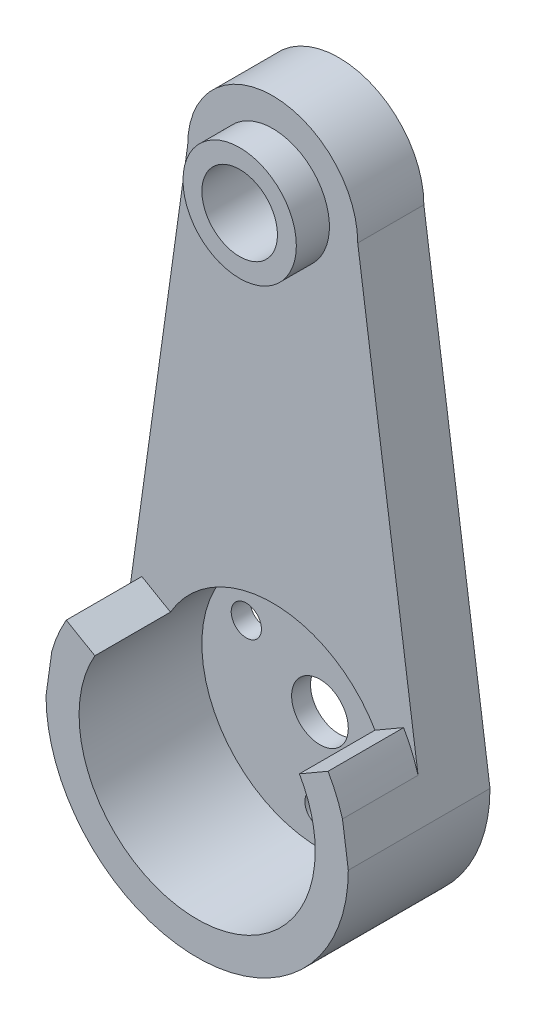
ISO-10303-21;
HEADER;
FILE_DESCRIPTION(('STEP AP214'),'2;1');
FILE_NAME('part.step','',(''),(''),'','','');
FILE_SCHEMA(('AUTOMOTIVE_DESIGN { 1 0 10303 214 1 1 1 1 }'));
ENDSEC;
DATA;
#1=APPLICATION_CONTEXT('core data for automotive mechanical design processes');
#2=APPLICATION_PROTOCOL_DEFINITION('international standard','automotive_design',2000,#1);
#3=PRODUCT_CONTEXT('',#1,'mechanical');
#4=PRODUCT('Part','Part','',(#3));
#5=PRODUCT_RELATED_PRODUCT_CATEGORY('part','',(#4));
#6=PRODUCT_DEFINITION_FORMATION('','',#4);
#7=PRODUCT_DEFINITION_CONTEXT('part definition',#1,'design');
#8=PRODUCT_DEFINITION('design','',#6,#7);
#9=PRODUCT_DEFINITION_SHAPE('','',#8);
#10=(LENGTH_UNIT() NAMED_UNIT(*) SI_UNIT(.MILLI.,.METRE.));
#11=(NAMED_UNIT(*) PLANE_ANGLE_UNIT() SI_UNIT($,.RADIAN.));
#12=(NAMED_UNIT(*) SI_UNIT($,.STERADIAN.) SOLID_ANGLE_UNIT());
#13=UNCERTAINTY_MEASURE_WITH_UNIT(LENGTH_MEASURE(1.E-05),#10,'distance_accuracy_value','');
#14=(GEOMETRIC_REPRESENTATION_CONTEXT(3) GLOBAL_UNCERTAINTY_ASSIGNED_CONTEXT((#13)) GLOBAL_UNIT_ASSIGNED_CONTEXT((#10,
#11,#12)) REPRESENTATION_CONTEXT('',''));
#15=CARTESIAN_POINT('',(0.,0.,0.));
#16=DIRECTION('',(0.,0.,1.));
#17=DIRECTION('',(1.,0.,0.));
#18=AXIS2_PLACEMENT_3D('',#15,#16,#17);
#19=CARTESIAN_POINT('',(0.,0.,7.));
#20=DIRECTION('',(0.,0.,-1.));
#21=DIRECTION('',(-1.,0.,0.));
#22=AXIS2_PLACEMENT_3D('',#19,#20,#21);
#23=PLANE('',#22);
#24=CARTESIAN_POINT('',(0.,0.,7.));
#25=DIRECTION('',(0.,0.,-1.));
#26=DIRECTION('',(-1.,0.,0.));
#27=AXIS2_PLACEMENT_3D('',#24,#25,#26);
#28=CIRCLE('',#27,6.);
#29=CARTESIAN_POINT('',(-6.,0.,7.));
#30=VERTEX_POINT('',#29);
#31=EDGE_CURVE('E11',#30,#30,#28,.F.);
#32=ORIENTED_EDGE('',*,*,#31,.F.);
#33=EDGE_LOOP('',(#32));
#34=FACE_BOUND('',#33,.T.);
#35=CARTESIAN_POINT('',(0.,-50.,7.));
#36=DIRECTION('',(0.,0.,1.));
#37=DIRECTION('',(1.,0.,0.));
#38=AXIS2_PLACEMENT_3D('',#35,#36,#37);
#39=CIRCLE('',#38,16.);
#40=CARTESIAN_POINT('',(15.3848568065908,-45.6061200470773,7.));
#41=VERTEX_POINT('',#40);
#42=CARTESIAN_POINT('',(13.8564064605511,-42.0000000000001,7.));
#43=VERTEX_POINT('',#42);
#44=EDGE_CURVE('E308',#41,#43,#39,.T.);
#45=ORIENTED_EDGE('',*,*,#44,.F.);
#46=DIRECTION('',(-0.138647844534406,0.99034174667433,0.));
#47=VECTOR('',#46,1.);
#48=CARTESIAN_POINT('',(9.,0.,7.));
#49=LINE('',#48,#47);
#50=CARTESIAN_POINT('',(9.,0.,7.));
#51=VERTEX_POINT('',#50);
#52=EDGE_CURVE('E66',#41,#51,#49,.T.);
#53=ORIENTED_EDGE('',*,*,#52,.T.);
#54=CARTESIAN_POINT('',(0.,0.,7.));
#55=DIRECTION('',(0.,0.,1.));
#56=DIRECTION('',(-1.,0.,0.));
#57=AXIS2_PLACEMENT_3D('',#54,#55,#56);
#58=CIRCLE('',#57,9.);
#59=CARTESIAN_POINT('',(-9.,0.,7.));
#60=VERTEX_POINT('',#59);
#61=EDGE_CURVE('E97',#51,#60,#58,.T.);
#62=ORIENTED_EDGE('',*,*,#61,.T.);
#63=DIRECTION('',(-0.138647844534406,-0.99034174667433,0.));
#64=VECTOR('',#63,1.);
#65=CARTESIAN_POINT('',(-9.,0.,7.));
#66=LINE('',#65,#64);
#67=CARTESIAN_POINT('',(-15.3848568065908,-45.6061200470774,7.));
#68=VERTEX_POINT('',#67);
#69=EDGE_CURVE('E156',#60,#68,#66,.T.);
#70=ORIENTED_EDGE('',*,*,#69,.T.);
#71=CARTESIAN_POINT('',(-13.8564064605511,-42.0000000000001,7.));
#72=VERTEX_POINT('',#71);
#73=EDGE_CURVE('E163',#72,#68,#39,.T.);
#74=ORIENTED_EDGE('',*,*,#73,.F.);
#75=DIRECTION('',(0.866025403784442,-0.499999999999994,0.));
#76=VECTOR('',#75,1.);
#77=CARTESIAN_POINT('',(-21.6506350946108,-37.5000000000003,7.));
#78=LINE('',#77,#76);
#79=CARTESIAN_POINT('',(-10.8253175473055,-43.7500000000001,7.));
#80=VERTEX_POINT('',#79);
#81=EDGE_CURVE('E186',#72,#80,#78,.T.);
#82=ORIENTED_EDGE('',*,*,#81,.T.);
#83=CARTESIAN_POINT('',(0.,-50.,7.));
#84=DIRECTION('',(0.,0.,1.));
#85=DIRECTION('',(1.,0.,0.));
#86=AXIS2_PLACEMENT_3D('',#83,#84,#85);
#87=CIRCLE('',#86,12.5);
#88=CARTESIAN_POINT('',(10.8253175473055,-43.7500000000001,7.));
#89=VERTEX_POINT('',#88);
#90=EDGE_CURVE('E133',#89,#80,#87,.T.);
#91=ORIENTED_EDGE('',*,*,#90,.F.);
#92=DIRECTION('',(0.866025403784441,0.499999999999996,0.));
#93=VECTOR('',#92,1.);
#94=CARTESIAN_POINT('',(21.6506350946108,-37.5000000000002,7.));
#95=LINE('',#94,#93);
#96=EDGE_CURVE('E57',#89,#43,#95,.T.);
#97=ORIENTED_EDGE('',*,*,#96,.T.);
#98=EDGE_LOOP('',(#45,#53,#62,#70,#74,#82,#91,#97));
#99=FACE_BOUND('',#98,.T.);
#100=ADVANCED_FACE('F41',(#34,#99),#23,.F.);
#101=CARTESIAN_POINT('',(0.,-50.,0.));
#102=DIRECTION('',(0.,0.,1.));
#103=DIRECTION('',(1.,0.,0.));
#104=AXIS2_PLACEMENT_3D('',#101,#102,#103);
#105=CYLINDRICAL_SURFACE('',#104,3.);
#106=CARTESIAN_POINT('',(0.,-50.,0.));
#107=DIRECTION('',(0.,0.,1.));
#108=DIRECTION('',(1.,0.,0.));
#109=AXIS2_PLACEMENT_3D('',#106,#107,#108);
#110=CIRCLE('',#109,3.);
#111=CARTESIAN_POINT('',(3.00000000000001,-50.,0.));
#112=VERTEX_POINT('',#111);
#113=EDGE_CURVE('E108',#112,#112,#110,.T.);
#114=ORIENTED_EDGE('',*,*,#113,.F.);
#115=EDGE_LOOP('',(#114));
#116=FACE_BOUND('',#115,.T.);
#117=CARTESIAN_POINT('',(0.,-50.,2.));
#118=DIRECTION('',(0.,0.,1.));
#119=DIRECTION('',(1.,0.,0.));
#120=AXIS2_PLACEMENT_3D('',#117,#118,#119);
#121=CIRCLE('',#120,3.);
#122=CARTESIAN_POINT('',(3.00000000000001,-50.,2.));
#123=VERTEX_POINT('',#122);
#124=EDGE_CURVE('E145',#123,#123,#121,.F.);
#125=ORIENTED_EDGE('',*,*,#124,.F.);
#126=EDGE_LOOP('',(#125));
#127=FACE_BOUND('',#126,.T.);
#128=ADVANCED_FACE('F215',(#116,#127),#105,.F.);
#129=CARTESIAN_POINT('',(7.79422863405995,-45.5,0.));
#130=DIRECTION('',(0.,0.,1.));
#131=DIRECTION('',(1.,0.,0.));
#132=AXIS2_PLACEMENT_3D('',#129,#130,#131);
#133=CYLINDRICAL_SURFACE('',#132,1.6);
#134=CARTESIAN_POINT('',(7.79422863405995,-45.5,0.));
#135=DIRECTION('',(0.,0.,1.));
#136=DIRECTION('',(1.,0.,0.));
#137=AXIS2_PLACEMENT_3D('',#134,#135,#136);
#138=CIRCLE('',#137,1.6);
#139=CARTESIAN_POINT('',(9.39422863405995,-45.5,0.));
#140=VERTEX_POINT('',#139);
#141=EDGE_CURVE('E148',#140,#140,#138,.T.);
#142=ORIENTED_EDGE('',*,*,#141,.F.);
#143=EDGE_LOOP('',(#142));
#144=FACE_BOUND('',#143,.T.);
#145=CARTESIAN_POINT('',(7.79422863405995,-45.5,2.));
#146=DIRECTION('',(0.,0.,1.));
#147=DIRECTION('',(1.,0.,0.));
#148=AXIS2_PLACEMENT_3D('',#145,#146,#147);
#149=CIRCLE('',#148,1.6);
#150=CARTESIAN_POINT('',(9.39422863405995,-45.5,2.));
#151=VERTEX_POINT('',#150);
#152=EDGE_CURVE('E130',#151,#151,#149,.F.);
#153=ORIENTED_EDGE('',*,*,#152,.F.);
#154=EDGE_LOOP('',(#153));
#155=FACE_BOUND('',#154,.T.);
#156=ADVANCED_FACE('F220',(#144,#155),#133,.F.);
#157=CARTESIAN_POINT('',(-7.7942286340599,-45.4999999999999,0.));
#158=DIRECTION('',(0.,0.,1.));
#159=DIRECTION('',(1.,0.,0.));
#160=AXIS2_PLACEMENT_3D('',#157,#158,#159);
#161=CYLINDRICAL_SURFACE('',#160,1.6);
#162=CARTESIAN_POINT('',(-7.7942286340599,-45.4999999999999,0.));
#163=DIRECTION('',(0.,0.,1.));
#164=DIRECTION('',(1.,0.,0.));
#165=AXIS2_PLACEMENT_3D('',#162,#163,#164);
#166=CIRCLE('',#165,1.6);
#167=CARTESIAN_POINT('',(-6.1942286340599,-45.4999999999999,0.));
#168=VERTEX_POINT('',#167);
#169=EDGE_CURVE('E151',#168,#168,#166,.T.);
#170=ORIENTED_EDGE('',*,*,#169,.F.);
#171=EDGE_LOOP('',(#170));
#172=FACE_BOUND('',#171,.T.);
#173=CARTESIAN_POINT('',(-7.7942286340599,-45.4999999999999,2.));
#174=DIRECTION('',(0.,0.,1.));
#175=DIRECTION('',(1.,0.,0.));
#176=AXIS2_PLACEMENT_3D('',#173,#174,#175);
#177=CIRCLE('',#176,1.6);
#178=CARTESIAN_POINT('',(-6.1942286340599,-45.4999999999999,2.));
#179=VERTEX_POINT('',#178);
#180=EDGE_CURVE('E125',#179,#179,#177,.F.);
#181=ORIENTED_EDGE('',*,*,#180,.F.);
#182=EDGE_LOOP('',(#181));
#183=FACE_BOUND('',#182,.T.);
#184=ADVANCED_FACE('F242',(#172,#183),#161,.F.);
#185=CARTESIAN_POINT('',(0.,-59.,0.));
#186=DIRECTION('',(0.,0.,1.));
#187=DIRECTION('',(1.,0.,0.));
#188=AXIS2_PLACEMENT_3D('',#185,#186,#187);
#189=CYLINDRICAL_SURFACE('',#188,1.6);
#190=CARTESIAN_POINT('',(0.,-59.,0.));
#191=DIRECTION('',(0.,0.,1.));
#192=DIRECTION('',(1.,0.,0.));
#193=AXIS2_PLACEMENT_3D('',#190,#191,#192);
#194=CIRCLE('',#193,1.6);
#195=CARTESIAN_POINT('',(1.6,-59.,0.));
#196=VERTEX_POINT('',#195);
#197=EDGE_CURVE('E112',#196,#196,#194,.T.);
#198=ORIENTED_EDGE('',*,*,#197,.F.);
#199=EDGE_LOOP('',(#198));
#200=FACE_BOUND('',#199,.T.);
#201=CARTESIAN_POINT('',(0.,-59.,2.));
#202=DIRECTION('',(0.,0.,1.));
#203=DIRECTION('',(1.,0.,0.));
#204=AXIS2_PLACEMENT_3D('',#201,#202,#203);
#205=CIRCLE('',#204,1.6);
#206=CARTESIAN_POINT('',(1.6,-59.,2.));
#207=VERTEX_POINT('',#206);
#208=EDGE_CURVE('E123',#207,#207,#205,.F.);
#209=ORIENTED_EDGE('',*,*,#208,.F.);
#210=EDGE_LOOP('',(#209));
#211=FACE_BOUND('',#210,.T.);
#212=ADVANCED_FACE('F238',(#200,#211),#189,.F.);
#213=CARTESIAN_POINT('',(0.,0.,7.));
#214=DIRECTION('',(0.,0.,-1.));
#215=DIRECTION('',(-1.,0.,0.));
#216=AXIS2_PLACEMENT_3D('',#213,#214,#215);
#217=CYLINDRICAL_SURFACE('',#216,9.);
#218=CARTESIAN_POINT('',(0.,0.,0.));
#219=DIRECTION('',(0.,0.,1.));
#220=DIRECTION('',(-1.,0.,0.));
#221=AXIS2_PLACEMENT_3D('',#218,#219,#220);
#222=CIRCLE('',#221,9.);
#223=CARTESIAN_POINT('',(9.,0.,0.));
#224=VERTEX_POINT('',#223);
#225=CARTESIAN_POINT('',(-9.,0.,0.));
#226=VERTEX_POINT('',#225);
#227=EDGE_CURVE('E103',#224,#226,#222,.T.);
#228=ORIENTED_EDGE('',*,*,#227,.T.);
#229=DIRECTION('',(0.,0.,-1.));
#230=VECTOR('',#229,1.);
#231=CARTESIAN_POINT('',(-9.,0.,7.));
#232=LINE('',#231,#230);
#233=EDGE_CURVE('E50',#60,#226,#232,.T.);
#234=ORIENTED_EDGE('',*,*,#233,.F.);
#235=ORIENTED_EDGE('',*,*,#61,.F.);
#236=DIRECTION('',(0.,0.,-1.));
#237=VECTOR('',#236,1.);
#238=CARTESIAN_POINT('',(9.,0.,7.));
#239=LINE('',#238,#237);
#240=EDGE_CURVE('E89',#51,#224,#239,.T.);
#241=ORIENTED_EDGE('',*,*,#240,.T.);
#242=EDGE_LOOP('',(#228,#234,#235,#241));
#243=FACE_BOUND('',#242,.T.);
#244=ADVANCED_FACE('F43',(#243),#217,.T.);
#245=CARTESIAN_POINT('',(-9.,0.,7.));
#246=DIRECTION('',(0.99034174667433,-0.138647844534406,0.));
#247=DIRECTION('',(0.138647844534406,0.99034174667433,0.));
#248=AXIS2_PLACEMENT_3D('',#245,#246,#247);
#249=PLANE('',#248);
#250=DIRECTION('',(-0.138647844534406,-0.99034174667433,0.));
#251=VECTOR('',#250,1.);
#252=CARTESIAN_POINT('',(-9.,0.,0.));
#253=LINE('',#252,#251);
#254=CARTESIAN_POINT('',(-16.,-50.,0.));
#255=VERTEX_POINT('',#254);
#256=EDGE_CURVE('E106',#226,#255,#253,.T.);
#257=ORIENTED_EDGE('',*,*,#256,.T.);
#258=DIRECTION('',(0.,0.,-1.));
#259=VECTOR('',#258,1.);
#260=CARTESIAN_POINT('',(-16.,-50.,7.));
#261=LINE('',#260,#259);
#262=CARTESIAN_POINT('',(-16.,-50.,15.));
#263=VERTEX_POINT('',#262);
#264=EDGE_CURVE('E119',#263,#255,#261,.T.);
#265=ORIENTED_EDGE('',*,*,#264,.F.);
#266=DIRECTION('',(-0.138647844534406,-0.99034174667433,0.));
#267=VECTOR('',#266,1.);
#268=CARTESIAN_POINT('',(-8.82699097685367,1.23577873675951,15.));
#269=LINE('',#268,#267);
#270=CARTESIAN_POINT('',(-15.3848568065908,-45.6061200470774,15.));
#271=VERTEX_POINT('',#270);
#272=EDGE_CURVE('E174',#271,#263,#269,.T.);
#273=ORIENTED_EDGE('',*,*,#272,.F.);
#274=DIRECTION('',(0.,0.,-1.));
#275=VECTOR('',#274,1.);
#276=CARTESIAN_POINT('',(-15.3848568065908,-45.6061200470774,15.));
#277=LINE('',#276,#275);
#278=EDGE_CURVE('E170',#271,#68,#277,.T.);
#279=ORIENTED_EDGE('',*,*,#278,.T.);
#280=ORIENTED_EDGE('',*,*,#69,.F.);
#281=ORIENTED_EDGE('',*,*,#233,.T.);
#282=EDGE_LOOP('',(#257,#265,#273,#279,#280,#281));
#283=FACE_BOUND('',#282,.T.);
#284=ADVANCED_FACE('F167',(#283),#249,.F.);
#285=CARTESIAN_POINT('',(0.,-50.,7.));
#286=DIRECTION('',(0.,0.,-1.));
#287=DIRECTION('',(-1.,0.,0.));
#288=AXIS2_PLACEMENT_3D('',#285,#286,#287);
#289=CYLINDRICAL_SURFACE('',#288,16.);
#290=CARTESIAN_POINT('',(0.,-50.,0.));
#291=DIRECTION('',(0.,0.,1.));
#292=DIRECTION('',(1.,0.,0.));
#293=AXIS2_PLACEMENT_3D('',#290,#291,#292);
#294=CIRCLE('',#293,16.);
#295=CARTESIAN_POINT('',(16.,-50.,0.));
#296=VERTEX_POINT('',#295);
#297=EDGE_CURVE('E98',#255,#296,#294,.T.);
#298=ORIENTED_EDGE('',*,*,#297,.T.);
#299=DIRECTION('',(0.,0.,-1.));
#300=VECTOR('',#299,1.);
#301=CARTESIAN_POINT('',(16.,-50.,7.));
#302=LINE('',#301,#300);
#303=CARTESIAN_POINT('',(16.,-50.,15.));
#304=VERTEX_POINT('',#303);
#305=EDGE_CURVE('E93',#304,#296,#302,.T.);
#306=ORIENTED_EDGE('',*,*,#305,.F.);
#307=CARTESIAN_POINT('',(0.,-50.,15.));
#308=DIRECTION('',(0.,0.,1.));
#309=DIRECTION('',(1.,0.,0.));
#310=AXIS2_PLACEMENT_3D('',#307,#308,#309);
#311=CIRCLE('',#310,16.);
#312=EDGE_CURVE('E178',#263,#304,#311,.T.);
#313=ORIENTED_EDGE('',*,*,#312,.F.);
#314=ORIENTED_EDGE('',*,*,#264,.T.);
#315=EDGE_LOOP('',(#298,#306,#313,#314));
#316=FACE_BOUND('',#315,.T.);
#317=ADVANCED_FACE('F231',(#316),#289,.T.);
#318=CARTESIAN_POINT('',(9.,0.,7.));
#319=DIRECTION('',(-0.99034174667433,-0.138647844534406,0.));
#320=DIRECTION('',(0.138647844534406,-0.99034174667433,0.));
#321=AXIS2_PLACEMENT_3D('',#318,#319,#320);
#322=PLANE('',#321);
#323=DIRECTION('',(-0.138647844534406,0.99034174667433,0.));
#324=VECTOR('',#323,1.);
#325=CARTESIAN_POINT('',(9.,0.,0.));
#326=LINE('',#325,#324);
#327=EDGE_CURVE('E86',#296,#224,#326,.T.);
#328=ORIENTED_EDGE('',*,*,#327,.T.);
#329=ORIENTED_EDGE('',*,*,#240,.F.);
#330=ORIENTED_EDGE('',*,*,#52,.F.);
#331=DIRECTION('',(0.,0.,-1.));
#332=VECTOR('',#331,1.);
#333=CARTESIAN_POINT('',(15.3848568065908,-45.6061200470773,15.));
#334=LINE('',#333,#332);
#335=CARTESIAN_POINT('',(15.3848568065908,-45.6061200470773,15.));
#336=VERTEX_POINT('',#335);
#337=EDGE_CURVE('E195',#336,#41,#334,.T.);
#338=ORIENTED_EDGE('',*,*,#337,.F.);
#339=DIRECTION('',(-0.138647844534406,0.99034174667433,0.));
#340=VECTOR('',#339,1.);
#341=CARTESIAN_POINT('',(8.82699097685367,1.23577873675951,15.));
#342=LINE('',#341,#340);
#343=EDGE_CURVE('E294',#304,#336,#342,.T.);
#344=ORIENTED_EDGE('',*,*,#343,.F.);
#345=ORIENTED_EDGE('',*,*,#305,.T.);
#346=EDGE_LOOP('',(#328,#329,#330,#338,#344,#345));
#347=FACE_BOUND('',#346,.T.);
#348=ADVANCED_FACE('F88',(#347),#322,.F.);
#349=CARTESIAN_POINT('',(0.,0.,0.));
#350=DIRECTION('',(0.,0.,-1.));
#351=DIRECTION('',(-1.,0.,0.));
#352=AXIS2_PLACEMENT_3D('',#349,#350,#351);
#353=PLANE('',#352);
#354=CARTESIAN_POINT('',(0.,0.,0.));
#355=DIRECTION('',(0.,0.,-1.));
#356=DIRECTION('',(-1.,0.,0.));
#357=AXIS2_PLACEMENT_3D('',#354,#355,#356);
#358=CIRCLE('',#357,4.);
#359=CARTESIAN_POINT('',(-4.,0.,0.));
#360=VERTEX_POINT('',#359);
#361=EDGE_CURVE('E45',#360,#360,#358,.T.);
#362=ORIENTED_EDGE('',*,*,#361,.F.);
#363=EDGE_LOOP('',(#362));
#364=FACE_BOUND('',#363,.T.);
#365=ORIENTED_EDGE('',*,*,#197,.T.);
#366=EDGE_LOOP('',(#365));
#367=FACE_BOUND('',#366,.T.);
#368=ORIENTED_EDGE('',*,*,#169,.T.);
#369=EDGE_LOOP('',(#368));
#370=FACE_BOUND('',#369,.T.);
#371=ORIENTED_EDGE('',*,*,#141,.T.);
#372=EDGE_LOOP('',(#371));
#373=FACE_BOUND('',#372,.T.);
#374=ORIENTED_EDGE('',*,*,#113,.T.);
#375=EDGE_LOOP('',(#374));
#376=FACE_BOUND('',#375,.T.);
#377=ORIENTED_EDGE('',*,*,#227,.F.);
#378=ORIENTED_EDGE('',*,*,#327,.F.);
#379=ORIENTED_EDGE('',*,*,#297,.F.);
#380=ORIENTED_EDGE('',*,*,#256,.F.);
#381=EDGE_LOOP('',(#377,#378,#379,#380));
#382=FACE_BOUND('',#381,.T.);
#383=ADVANCED_FACE('F105',(#364,#367,#370,#373,#376,#382),#353,.T.);
#384=CARTESIAN_POINT('',(0.,-50.,2.));
#385=DIRECTION('',(0.,0.,1.));
#386=DIRECTION('',(1.,0.,0.));
#387=AXIS2_PLACEMENT_3D('',#384,#385,#386);
#388=PLANE('',#387);
#389=CARTESIAN_POINT('',(0.,-50.,2.));
#390=DIRECTION('',(0.,0.,1.));
#391=DIRECTION('',(1.,0.,0.));
#392=AXIS2_PLACEMENT_3D('',#389,#390,#391);
#393=CIRCLE('',#392,12.5);
#394=CARTESIAN_POINT('',(12.5,-50.,2.));
#395=VERTEX_POINT('',#394);
#396=EDGE_CURVE('E126',#395,#395,#393,.T.);
#397=ORIENTED_EDGE('',*,*,#396,.T.);
#398=EDGE_LOOP('',(#397));
#399=FACE_BOUND('',#398,.T.);
#400=ORIENTED_EDGE('',*,*,#208,.T.);
#401=EDGE_LOOP('',(#400));
#402=FACE_BOUND('',#401,.T.);
#403=ORIENTED_EDGE('',*,*,#180,.T.);
#404=EDGE_LOOP('',(#403));
#405=FACE_BOUND('',#404,.T.);
#406=ORIENTED_EDGE('',*,*,#152,.T.);
#407=EDGE_LOOP('',(#406));
#408=FACE_BOUND('',#407,.T.);
#409=ORIENTED_EDGE('',*,*,#124,.T.);
#410=EDGE_LOOP('',(#409));
#411=FACE_BOUND('',#410,.T.);
#412=ADVANCED_FACE('F227',(#399,#402,#405,#408,#411),#388,.T.);
#413=CARTESIAN_POINT('',(0.,-50.,2.));
#414=DIRECTION('',(0.,0.,1.));
#415=DIRECTION('',(1.,0.,0.));
#416=AXIS2_PLACEMENT_3D('',#413,#414,#415);
#417=CYLINDRICAL_SURFACE('',#416,12.5);
#418=ORIENTED_EDGE('',*,*,#396,.F.);
#419=EDGE_LOOP('',(#418));
#420=FACE_BOUND('',#419,.T.);
#421=ORIENTED_EDGE('',*,*,#90,.T.);
#422=DIRECTION('',(0.,0.,-1.));
#423=VECTOR('',#422,1.);
#424=CARTESIAN_POINT('',(-10.8253175473055,-43.7500000000001,15.));
#425=LINE('',#424,#423);
#426=CARTESIAN_POINT('',(-10.8253175473055,-43.7500000000001,15.));
#427=VERTEX_POINT('',#426);
#428=EDGE_CURVE('E181',#427,#80,#425,.T.);
#429=ORIENTED_EDGE('',*,*,#428,.F.);
#430=CARTESIAN_POINT('',(0.,-50.,15.));
#431=DIRECTION('',(0.,0.,1.));
#432=DIRECTION('',(1.,0.,0.));
#433=AXIS2_PLACEMENT_3D('',#430,#431,#432);
#434=CIRCLE('',#433,12.5);
#435=CARTESIAN_POINT('',(10.8253175473055,-43.7500000000001,15.));
#436=VERTEX_POINT('',#435);
#437=EDGE_CURVE('E324',#436,#427,#434,.F.);
#438=ORIENTED_EDGE('',*,*,#437,.F.);
#439=DIRECTION('',(0.,0.,-1.));
#440=VECTOR('',#439,1.);
#441=CARTESIAN_POINT('',(10.8253175473055,-43.7500000000001,15.));
#442=LINE('',#441,#440);
#443=EDGE_CURVE('E191',#436,#89,#442,.T.);
#444=ORIENTED_EDGE('',*,*,#443,.T.);
#445=EDGE_LOOP('',(#421,#429,#438,#444));
#446=FACE_BOUND('',#445,.T.);
#447=ADVANCED_FACE('F253',(#420,#446),#417,.F.);
#448=CARTESIAN_POINT('',(0.,0.,10.5));
#449=DIRECTION('',(0.,0.,1.));
#450=DIRECTION('',(1.,0.,0.));
#451=AXIS2_PLACEMENT_3D('',#448,#449,#450);
#452=PLANE('',#451);
#453=CARTESIAN_POINT('',(0.,0.,10.5));
#454=DIRECTION('',(0.,0.,1.));
#455=DIRECTION('',(1.,0.,0.));
#456=AXIS2_PLACEMENT_3D('',#453,#454,#455);
#457=CIRCLE('',#456,6.);
#458=CARTESIAN_POINT('',(6.,0.,10.5));
#459=VERTEX_POINT('',#458);
#460=EDGE_CURVE('E138',#459,#459,#457,.T.);
#461=ORIENTED_EDGE('',*,*,#460,.T.);
#462=EDGE_LOOP('',(#461));
#463=FACE_BOUND('',#462,.T.);
#464=CARTESIAN_POINT('',(0.,0.,10.5));
#465=DIRECTION('',(0.,0.,1.));
#466=DIRECTION('',(1.,0.,0.));
#467=AXIS2_PLACEMENT_3D('',#464,#465,#466);
#468=CIRCLE('',#467,4.);
#469=CARTESIAN_POINT('',(4.,0.,10.5));
#470=VERTEX_POINT('',#469);
#471=EDGE_CURVE('E197',#470,#470,#468,.T.);
#472=ORIENTED_EDGE('',*,*,#471,.F.);
#473=EDGE_LOOP('',(#472));
#474=FACE_BOUND('',#473,.T.);
#475=ADVANCED_FACE('F204',(#463,#474),#452,.T.);
#476=CARTESIAN_POINT('',(0.,0.,10.5));
#477=DIRECTION('',(0.,0.,-1.));
#478=DIRECTION('',(-1.,0.,0.));
#479=AXIS2_PLACEMENT_3D('',#476,#477,#478);
#480=CYLINDRICAL_SURFACE('',#479,6.);
#481=ORIENTED_EDGE('',*,*,#460,.F.);
#482=EDGE_LOOP('',(#481));
#483=FACE_BOUND('',#482,.T.);
#484=ORIENTED_EDGE('',*,*,#31,.T.);
#485=EDGE_LOOP('',(#484));
#486=FACE_BOUND('',#485,.T.);
#487=ADVANCED_FACE('F207',(#483,#486),#480,.T.);
#488=CARTESIAN_POINT('',(0.,0.,10.5));
#489=DIRECTION('',(0.,0.,-1.));
#490=DIRECTION('',(-1.,0.,0.));
#491=AXIS2_PLACEMENT_3D('',#488,#489,#490);
#492=CYLINDRICAL_SURFACE('',#491,4.);
#493=ORIENTED_EDGE('',*,*,#471,.T.);
#494=EDGE_LOOP('',(#493));
#495=FACE_BOUND('',#494,.T.);
#496=ORIENTED_EDGE('',*,*,#361,.T.);
#497=EDGE_LOOP('',(#496));
#498=FACE_BOUND('',#497,.T.);
#499=ADVANCED_FACE('F210',(#495,#498),#492,.F.);
#500=CARTESIAN_POINT('',(0.,-50.,15.));
#501=DIRECTION('',(0.,0.,-1.));
#502=DIRECTION('',(-1.,0.,0.));
#503=AXIS2_PLACEMENT_3D('',#500,#501,#502);
#504=CYLINDRICAL_SURFACE('',#503,16.);
#505=ORIENTED_EDGE('',*,*,#44,.T.);
#506=DIRECTION('',(0.,0.,-1.));
#507=VECTOR('',#506,1.);
#508=CARTESIAN_POINT('',(13.8564064605511,-42.0000000000001,15.));
#509=LINE('',#508,#507);
#510=CARTESIAN_POINT('',(13.8564064605511,-42.0000000000001,15.));
#511=VERTEX_POINT('',#510);
#512=EDGE_CURVE('E193',#511,#43,#509,.T.);
#513=ORIENTED_EDGE('',*,*,#512,.F.);
#514=CARTESIAN_POINT('',(0.,-50.,15.));
#515=DIRECTION('',(0.,0.,1.));
#516=DIRECTION('',(1.,0.,0.));
#517=AXIS2_PLACEMENT_3D('',#514,#515,#516);
#518=CIRCLE('',#517,16.);
#519=EDGE_CURVE('E299',#336,#511,#518,.T.);
#520=ORIENTED_EDGE('',*,*,#519,.F.);
#521=ORIENTED_EDGE('',*,*,#337,.T.);
#522=EDGE_LOOP('',(#505,#513,#520,#521));
#523=FACE_BOUND('',#522,.T.);
#524=ADVANCED_FACE('F276',(#523),#504,.T.);
#525=CARTESIAN_POINT('',(21.6506350946108,-37.5000000000002,15.));
#526=DIRECTION('',(-0.499999999999996,0.866025403784441,0.));
#527=DIRECTION('',(-0.866025403784441,-0.499999999999996,0.));
#528=AXIS2_PLACEMENT_3D('',#525,#526,#527);
#529=PLANE('',#528);
#530=ORIENTED_EDGE('',*,*,#96,.F.);
#531=ORIENTED_EDGE('',*,*,#443,.F.);
#532=DIRECTION('',(0.866025403784441,0.499999999999996,0.));
#533=VECTOR('',#532,1.);
#534=CARTESIAN_POINT('',(21.6506350946108,-37.5000000000002,15.));
#535=LINE('',#534,#533);
#536=EDGE_CURVE('E326',#436,#511,#535,.T.);
#537=ORIENTED_EDGE('',*,*,#536,.T.);
#538=ORIENTED_EDGE('',*,*,#512,.T.);
#539=EDGE_LOOP('',(#530,#531,#537,#538));
#540=FACE_BOUND('',#539,.T.);
#541=ADVANCED_FACE('F277',(#540),#529,.T.);
#542=CARTESIAN_POINT('',(-21.6506350946108,-37.5000000000003,15.));
#543=DIRECTION('',(0.499999999999994,0.866025403784442,0.));
#544=DIRECTION('',(-0.866025403784442,0.499999999999994,0.));
#545=AXIS2_PLACEMENT_3D('',#542,#543,#544);
#546=PLANE('',#545);
#547=ORIENTED_EDGE('',*,*,#81,.F.);
#548=DIRECTION('',(0.,0.,-1.));
#549=VECTOR('',#548,1.);
#550=CARTESIAN_POINT('',(-13.8564064605511,-42.0000000000001,15.));
#551=LINE('',#550,#549);
#552=CARTESIAN_POINT('',(-13.8564064605511,-42.0000000000001,15.));
#553=VERTEX_POINT('',#552);
#554=EDGE_CURVE('E177',#553,#72,#551,.T.);
#555=ORIENTED_EDGE('',*,*,#554,.F.);
#556=DIRECTION('',(0.866025403784442,-0.499999999999994,0.));
#557=VECTOR('',#556,1.);
#558=CARTESIAN_POINT('',(-21.6506350946108,-37.5000000000003,15.));
#559=LINE('',#558,#557);
#560=EDGE_CURVE('E341',#553,#427,#559,.T.);
#561=ORIENTED_EDGE('',*,*,#560,.T.);
#562=ORIENTED_EDGE('',*,*,#428,.T.);
#563=EDGE_LOOP('',(#547,#555,#561,#562));
#564=FACE_BOUND('',#563,.T.);
#565=ADVANCED_FACE('F280',(#564),#546,.T.);
#566=ORIENTED_EDGE('',*,*,#73,.T.);
#567=ORIENTED_EDGE('',*,*,#278,.F.);
#568=EDGE_CURVE('E339',#553,#271,#518,.T.);
#569=ORIENTED_EDGE('',*,*,#568,.F.);
#570=ORIENTED_EDGE('',*,*,#554,.T.);
#571=EDGE_LOOP('',(#566,#567,#569,#570));
#572=FACE_BOUND('',#571,.T.);
#573=ADVANCED_FACE('F283',(#572),#504,.T.);
#574=CARTESIAN_POINT('',(0.,0.,15.));
#575=DIRECTION('',(0.,0.,1.));
#576=DIRECTION('',(1.,0.,0.));
#577=AXIS2_PLACEMENT_3D('',#574,#575,#576);
#578=PLANE('',#577);
#579=ORIENTED_EDGE('',*,*,#343,.T.);
#580=ORIENTED_EDGE('',*,*,#519,.T.);
#581=ORIENTED_EDGE('',*,*,#536,.F.);
#582=ORIENTED_EDGE('',*,*,#437,.T.);
#583=ORIENTED_EDGE('',*,*,#560,.F.);
#584=ORIENTED_EDGE('',*,*,#568,.T.);
#585=ORIENTED_EDGE('',*,*,#272,.T.);
#586=ORIENTED_EDGE('',*,*,#312,.T.);
#587=EDGE_LOOP('',(#579,#580,#581,#582,#583,#584,#585,#586));
#588=FACE_BOUND('',#587,.T.);
#589=ADVANCED_FACE('F287',(#588),#578,.T.);
#590=CLOSED_SHELL('',(#100,#128,#156,#184,#212,#244,#284,#317,#348,#383,#412,#447,#475,#487,
#499,#524,#541,#565,#573,#589));
#591=MANIFOLD_SOLID_BREP('B2',#590);
#592=ADVANCED_BREP_SHAPE_REPRESENTATION('',(#18,#591),#14);
#593=SHAPE_DEFINITION_REPRESENTATION(#9,#592);
ENDSEC;
END-ISO-10303-21;
